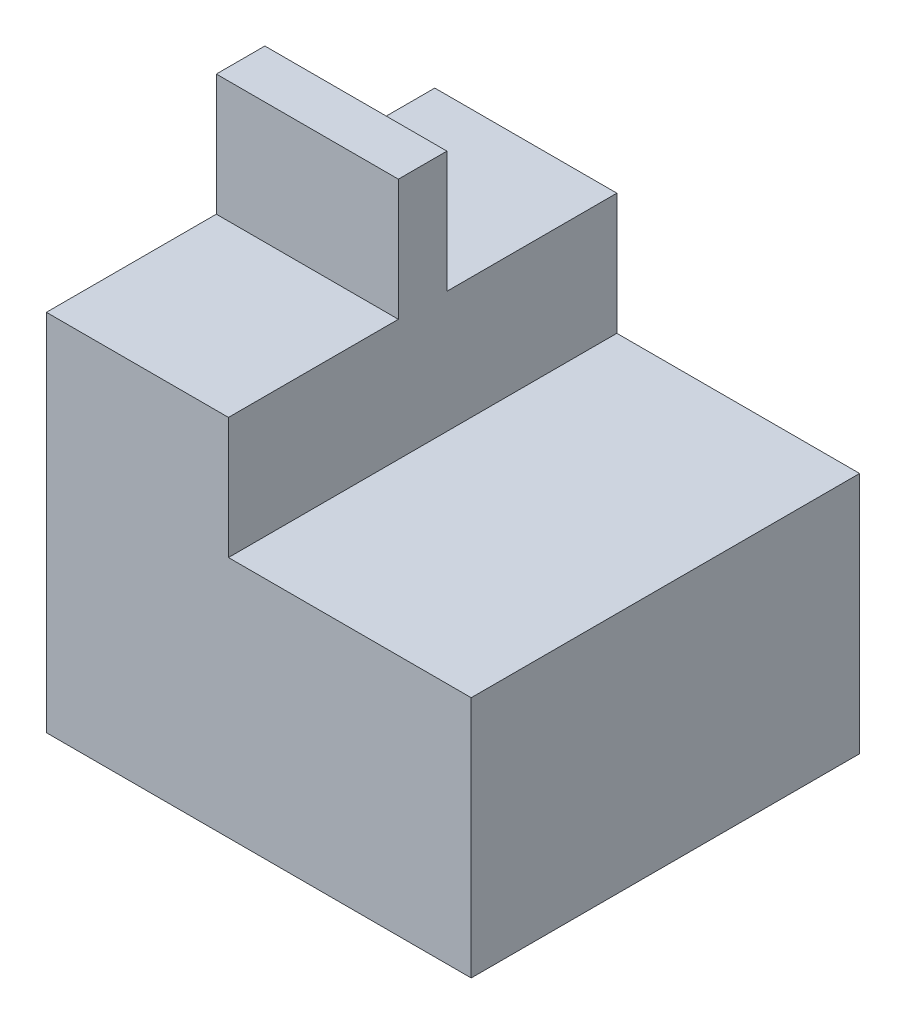
ISO-10303-21;
HEADER;
FILE_DESCRIPTION(('STEP AP214'),'2;1');
FILE_NAME('part.step','',(''),(''),'','','');
FILE_SCHEMA(('AUTOMOTIVE_DESIGN { 1 0 10303 214 1 1 1 1 }'));
ENDSEC;
DATA;
#1=APPLICATION_CONTEXT('core data for automotive mechanical design processes');
#2=APPLICATION_PROTOCOL_DEFINITION('international standard','automotive_design',2000,#1);
#3=PRODUCT_CONTEXT('',#1,'mechanical');
#4=PRODUCT('Part','Part','',(#3));
#5=PRODUCT_RELATED_PRODUCT_CATEGORY('part','',(#4));
#6=PRODUCT_DEFINITION_FORMATION('','',#4);
#7=PRODUCT_DEFINITION_CONTEXT('part definition',#1,'design');
#8=PRODUCT_DEFINITION('design','',#6,#7);
#9=PRODUCT_DEFINITION_SHAPE('','',#8);
#10=(LENGTH_UNIT() NAMED_UNIT(*) SI_UNIT(.MILLI.,.METRE.));
#11=(NAMED_UNIT(*) PLANE_ANGLE_UNIT() SI_UNIT($,.RADIAN.));
#12=(NAMED_UNIT(*) SI_UNIT($,.STERADIAN.) SOLID_ANGLE_UNIT());
#13=UNCERTAINTY_MEASURE_WITH_UNIT(LENGTH_MEASURE(1.E-05),#10,'distance_accuracy_value','');
#14=(GEOMETRIC_REPRESENTATION_CONTEXT(3) GLOBAL_UNCERTAINTY_ASSIGNED_CONTEXT((#13)) GLOBAL_UNIT_ASSIGNED_CONTEXT((#10,
#11,#12)) REPRESENTATION_CONTEXT('',''));
#15=CARTESIAN_POINT('',(0.,0.,0.));
#16=DIRECTION('',(0.,0.,1.));
#17=DIRECTION('',(1.,0.,0.));
#18=AXIS2_PLACEMENT_3D('',#15,#16,#17);
#19=CARTESIAN_POINT('',(-36.0322495659062,12.8778868253245,32.));
#20=DIRECTION('',(-1.,0.,0.));
#21=DIRECTION('',(0.,-1.,0.));
#22=AXIS2_PLACEMENT_3D('',#19,#20,#21);
#23=PLANE('',#22);
#24=DIRECTION('',(0.,0.,-1.));
#25=VECTOR('',#24,1.);
#26=CARTESIAN_POINT('',(-36.0322495659062,32.8778868253245,32.));
#27=LINE('',#26,#25);
#28=CARTESIAN_POINT('',(-36.0322495659062,32.8778868253245,18.));
#29=VERTEX_POINT('',#28);
#30=CARTESIAN_POINT('',(-36.0322495659062,32.8778868253245,14.));
#31=VERTEX_POINT('',#30);
#32=EDGE_CURVE('E236',#29,#31,#27,.T.);
#33=ORIENTED_EDGE('',*,*,#32,.F.);
#34=DIRECTION('',(0.,1.,0.));
#35=VECTOR('',#34,1.);
#36=CARTESIAN_POINT('',(-36.0322495659062,32.8778868253245,18.));
#37=LINE('',#36,#35);
#38=CARTESIAN_POINT('',(-36.0322495659062,22.8778868253245,18.));
#39=VERTEX_POINT('',#38);
#40=EDGE_CURVE('E154',#39,#29,#37,.T.);
#41=ORIENTED_EDGE('',*,*,#40,.F.);
#42=DIRECTION('',(0.,0.,-1.));
#43=VECTOR('',#42,1.);
#44=CARTESIAN_POINT('',(-36.0322495659062,22.8778868253245,32.));
#45=LINE('',#44,#43);
#46=CARTESIAN_POINT('',(-36.0322495659062,22.8778868253245,32.));
#47=VERTEX_POINT('',#46);
#48=EDGE_CURVE('E135',#47,#39,#45,.T.);
#49=ORIENTED_EDGE('',*,*,#48,.F.);
#50=DIRECTION('',(0.,1.,0.));
#51=VECTOR('',#50,1.);
#52=CARTESIAN_POINT('',(-36.0322495659062,12.8778868253245,32.));
#53=LINE('',#52,#51);
#54=CARTESIAN_POINT('',(-36.0322495659062,12.8778868253245,32.));
#55=VERTEX_POINT('',#54);
#56=EDGE_CURVE('E200',#55,#47,#53,.T.);
#57=ORIENTED_EDGE('',*,*,#56,.F.);
#58=DIRECTION('',(0.,0.,-1.));
#59=VECTOR('',#58,1.);
#60=CARTESIAN_POINT('',(-36.0322495659062,12.8778868253245,32.));
#61=LINE('',#60,#59);
#62=CARTESIAN_POINT('',(-36.0322495659062,12.8778868253245,0.));
#63=VERTEX_POINT('',#62);
#64=EDGE_CURVE('E211',#55,#63,#61,.T.);
#65=ORIENTED_EDGE('',*,*,#64,.T.);
#66=DIRECTION('',(0.,1.,0.));
#67=VECTOR('',#66,1.);
#68=CARTESIAN_POINT('',(-36.0322495659062,12.8778868253245,0.));
#69=LINE('',#68,#67);
#70=CARTESIAN_POINT('',(-36.0322495659062,22.8778868253245,0.));
#71=VERTEX_POINT('',#70);
#72=EDGE_CURVE('E196',#63,#71,#69,.T.);
#73=ORIENTED_EDGE('',*,*,#72,.T.);
#74=DIRECTION('',(0.,0.,-1.));
#75=VECTOR('',#74,1.);
#76=CARTESIAN_POINT('',(-36.0322495659062,22.8778868253245,0.));
#77=LINE('',#76,#75);
#78=CARTESIAN_POINT('',(-36.0322495659062,22.8778868253245,14.));
#79=VERTEX_POINT('',#78);
#80=EDGE_CURVE('E186',#79,#71,#77,.T.);
#81=ORIENTED_EDGE('',*,*,#80,.F.);
#82=DIRECTION('',(0.,-1.,0.));
#83=VECTOR('',#82,1.);
#84=CARTESIAN_POINT('',(-36.0322495659062,32.8778868253245,14.));
#85=LINE('',#84,#83);
#86=EDGE_CURVE('E160',#31,#79,#85,.T.);
#87=ORIENTED_EDGE('',*,*,#86,.F.);
#88=EDGE_LOOP('',(#33,#41,#49,#57,#65,#73,#81,#87));
#89=FACE_BOUND('',#88,.T.);
#90=ADVANCED_FACE('F33',(#89),#23,.F.);
#91=CARTESIAN_POINT('',(-36.0322495659062,32.8778868253245,32.));
#92=DIRECTION('',(0.,-1.,0.));
#93=DIRECTION('',(0.,0.,-1.));
#94=AXIS2_PLACEMENT_3D('',#91,#92,#93);
#95=PLANE('',#94);
#96=DIRECTION('',(0.,0.,-1.));
#97=VECTOR('',#96,1.);
#98=CARTESIAN_POINT('',(-51.0322495659062,32.8778868253245,32.));
#99=LINE('',#98,#97);
#100=CARTESIAN_POINT('',(-51.0322495659062,32.8778868253245,18.));
#101=VERTEX_POINT('',#100);
#102=CARTESIAN_POINT('',(-51.0322495659062,32.8778868253245,14.));
#103=VERTEX_POINT('',#102);
#104=EDGE_CURVE('E234',#101,#103,#99,.T.);
#105=ORIENTED_EDGE('',*,*,#104,.F.);
#106=DIRECTION('',(1.,0.,0.));
#107=VECTOR('',#106,1.);
#108=CARTESIAN_POINT('',(-51.0322495659062,32.8778868253245,18.));
#109=LINE('',#108,#107);
#110=EDGE_CURVE('E138',#101,#29,#109,.T.);
#111=ORIENTED_EDGE('',*,*,#110,.T.);
#112=ORIENTED_EDGE('',*,*,#32,.T.);
#113=DIRECTION('',(1.,0.,0.));
#114=VECTOR('',#113,1.);
#115=CARTESIAN_POINT('',(-51.0322495659062,32.8778868253245,14.));
#116=LINE('',#115,#114);
#117=EDGE_CURVE('E189',#103,#31,#116,.T.);
#118=ORIENTED_EDGE('',*,*,#117,.F.);
#119=EDGE_LOOP('',(#105,#111,#112,#118));
#120=FACE_BOUND('',#119,.T.);
#121=ADVANCED_FACE('F282',(#120),#95,.F.);
#122=CARTESIAN_POINT('',(-51.0322495659062,32.8778868253245,32.));
#123=DIRECTION('',(1.,0.,0.));
#124=DIRECTION('',(0.,0.,-1.));
#125=AXIS2_PLACEMENT_3D('',#122,#123,#124);
#126=PLANE('',#125);
#127=DIRECTION('',(0.,0.,1.));
#128=VECTOR('',#127,1.);
#129=CARTESIAN_POINT('',(-51.0322495659062,-2.12211317467547,10.));
#130=LINE('',#129,#128);
#131=CARTESIAN_POINT('',(-51.0322495659062,-2.12211317467547,10.));
#132=VERTEX_POINT('',#131);
#133=CARTESIAN_POINT('',(-51.0322495659062,-2.12211317467547,22.));
#134=VERTEX_POINT('',#133);
#135=EDGE_CURVE('E170',#132,#134,#130,.T.);
#136=ORIENTED_EDGE('',*,*,#135,.T.);
#137=DIRECTION('',(0.,-1.,0.));
#138=VECTOR('',#137,1.);
#139=CARTESIAN_POINT('',(-51.0322495659062,-12.1221131746755,22.));
#140=LINE('',#139,#138);
#141=CARTESIAN_POINT('',(-51.0322495659062,-7.12211317467548,22.));
#142=VERTEX_POINT('',#141);
#143=EDGE_CURVE('E163',#134,#142,#140,.T.);
#144=ORIENTED_EDGE('',*,*,#143,.T.);
#145=DIRECTION('',(0.,0.,-1.));
#146=VECTOR('',#145,1.);
#147=CARTESIAN_POINT('',(-51.0322495659062,-7.12211317467548,32.));
#148=LINE('',#147,#146);
#149=CARTESIAN_POINT('',(-51.0322495659062,-7.12211317467548,32.));
#150=VERTEX_POINT('',#149);
#151=EDGE_CURVE('E231',#150,#142,#148,.T.);
#152=ORIENTED_EDGE('',*,*,#151,.F.);
#153=DIRECTION('',(0.,-1.,0.));
#154=VECTOR('',#153,1.);
#155=CARTESIAN_POINT('',(-51.0322495659062,32.8778868253245,32.));
#156=LINE('',#155,#154);
#157=CARTESIAN_POINT('',(-51.0322495659062,22.8778868253245,32.));
#158=VERTEX_POINT('',#157);
#159=EDGE_CURVE('E153',#158,#150,#156,.T.);
#160=ORIENTED_EDGE('',*,*,#159,.F.);
#161=DIRECTION('',(0.,0.,-1.));
#162=VECTOR('',#161,1.);
#163=CARTESIAN_POINT('',(-51.0322495659062,22.8778868253245,32.));
#164=LINE('',#163,#162);
#165=CARTESIAN_POINT('',(-51.0322495659062,22.8778868253245,18.));
#166=VERTEX_POINT('',#165);
#167=EDGE_CURVE('E55',#158,#166,#164,.T.);
#168=ORIENTED_EDGE('',*,*,#167,.T.);
#169=DIRECTION('',(0.,1.,0.));
#170=VECTOR('',#169,1.);
#171=CARTESIAN_POINT('',(-51.0322495659062,32.8778868253245,18.));
#172=LINE('',#171,#170);
#173=EDGE_CURVE('E142',#166,#101,#172,.T.);
#174=ORIENTED_EDGE('',*,*,#173,.T.);
#175=ORIENTED_EDGE('',*,*,#104,.T.);
#176=DIRECTION('',(0.,-1.,0.));
#177=VECTOR('',#176,1.);
#178=CARTESIAN_POINT('',(-51.0322495659062,32.8778868253245,14.));
#179=LINE('',#178,#177);
#180=CARTESIAN_POINT('',(-51.0322495659062,22.8778868253245,14.));
#181=VERTEX_POINT('',#180);
#182=EDGE_CURVE('E182',#103,#181,#179,.T.);
#183=ORIENTED_EDGE('',*,*,#182,.T.);
#184=DIRECTION('',(0.,0.,-1.));
#185=VECTOR('',#184,1.);
#186=CARTESIAN_POINT('',(-51.0322495659062,22.8778868253245,0.));
#187=LINE('',#186,#185);
#188=CARTESIAN_POINT('',(-51.0322495659062,22.8778868253245,0.));
#189=VERTEX_POINT('',#188);
#190=EDGE_CURVE('E185',#181,#189,#187,.T.);
#191=ORIENTED_EDGE('',*,*,#190,.T.);
#192=DIRECTION('',(0.,-1.,0.));
#193=VECTOR('',#192,1.);
#194=CARTESIAN_POINT('',(-51.0322495659062,32.8778868253245,0.));
#195=LINE('',#194,#193);
#196=CARTESIAN_POINT('',(-51.0322495659062,-7.12211317467548,0.));
#197=VERTEX_POINT('',#196);
#198=EDGE_CURVE('E214',#189,#197,#195,.T.);
#199=ORIENTED_EDGE('',*,*,#198,.T.);
#200=CARTESIAN_POINT('',(-51.0322495659062,-7.12211317467548,10.));
#201=VERTEX_POINT('',#200);
#202=EDGE_CURVE('E230',#201,#197,#148,.T.);
#203=ORIENTED_EDGE('',*,*,#202,.F.);
#204=DIRECTION('',(0.,1.,0.));
#205=VECTOR('',#204,1.);
#206=CARTESIAN_POINT('',(-51.0322495659062,-12.1221131746755,10.));
#207=LINE('',#206,#205);
#208=EDGE_CURVE('E166',#201,#132,#207,.T.);
#209=ORIENTED_EDGE('',*,*,#208,.T.);
#210=EDGE_LOOP('',(#136,#144,#152,#160,#168,#174,#175,#183,#191,#199,#203,#209));
#211=FACE_BOUND('',#210,.T.);
#212=ADVANCED_FACE('F151',(#211),#126,.F.);
#213=CARTESIAN_POINT('',(-51.0322495659062,-7.12211317467548,32.));
#214=DIRECTION('',(0.,1.,0.));
#215=DIRECTION('',(0.,0.,1.));
#216=AXIS2_PLACEMENT_3D('',#213,#214,#215);
#217=PLANE('',#216);
#218=ORIENTED_EDGE('',*,*,#151,.T.);
#219=DIRECTION('',(1.,0.,0.));
#220=VECTOR('',#219,1.);
#221=CARTESIAN_POINT('',(-51.0322495659062,-7.12211317467548,22.));
#222=LINE('',#221,#220);
#223=CARTESIAN_POINT('',(-36.0322495659062,-7.12211317467548,22.));
#224=VERTEX_POINT('',#223);
#225=EDGE_CURVE('E11',#142,#224,#222,.T.);
#226=ORIENTED_EDGE('',*,*,#225,.T.);
#227=DIRECTION('',(0.,0.,-1.));
#228=VECTOR('',#227,1.);
#229=CARTESIAN_POINT('',(-36.0322495659062,-7.12211317467548,32.));
#230=LINE('',#229,#228);
#231=CARTESIAN_POINT('',(-36.0322495659062,-7.12211317467548,10.));
#232=VERTEX_POINT('',#231);
#233=EDGE_CURVE('E239',#224,#232,#230,.T.);
#234=ORIENTED_EDGE('',*,*,#233,.T.);
#235=DIRECTION('',(-1.,0.,0.));
#236=VECTOR('',#235,1.);
#237=CARTESIAN_POINT('',(-51.0322495659062,-7.12211317467548,9.99999999999999));
#238=LINE('',#237,#236);
#239=EDGE_CURVE('E40',#232,#201,#238,.T.);
#240=ORIENTED_EDGE('',*,*,#239,.T.);
#241=ORIENTED_EDGE('',*,*,#202,.T.);
#242=DIRECTION('',(1.,0.,0.));
#243=VECTOR('',#242,1.);
#244=CARTESIAN_POINT('',(-51.0322495659062,-7.12211317467548,0.));
#245=LINE('',#244,#243);
#246=CARTESIAN_POINT('',(-16.0322495659062,-7.12211317467548,0.));
#247=VERTEX_POINT('',#246);
#248=EDGE_CURVE('E217',#197,#247,#245,.T.);
#249=ORIENTED_EDGE('',*,*,#248,.T.);
#250=DIRECTION('',(0.,0.,-1.));
#251=VECTOR('',#250,1.);
#252=CARTESIAN_POINT('',(-16.0322495659062,-7.12211317467548,32.));
#253=LINE('',#252,#251);
#254=CARTESIAN_POINT('',(-16.0322495659062,-7.12211317467548,32.));
#255=VERTEX_POINT('',#254);
#256=EDGE_CURVE('E227',#255,#247,#253,.T.);
#257=ORIENTED_EDGE('',*,*,#256,.F.);
#258=DIRECTION('',(1.,0.,0.));
#259=VECTOR('',#258,1.);
#260=CARTESIAN_POINT('',(-51.0322495659062,-7.12211317467548,32.));
#261=LINE('',#260,#259);
#262=EDGE_CURVE('E205',#150,#255,#261,.T.);
#263=ORIENTED_EDGE('',*,*,#262,.F.);
#264=EDGE_LOOP('',(#218,#226,#234,#240,#241,#249,#257,#263));
#265=FACE_BOUND('',#264,.T.);
#266=ADVANCED_FACE('F244',(#265),#217,.F.);
#267=CARTESIAN_POINT('',(-16.0322495659062,-7.12211317467548,32.));
#268=DIRECTION('',(-1.,0.,0.));
#269=DIRECTION('',(0.,0.,1.));
#270=AXIS2_PLACEMENT_3D('',#267,#268,#269);
#271=PLANE('',#270);
#272=DIRECTION('',(0.,1.,0.));
#273=VECTOR('',#272,1.);
#274=CARTESIAN_POINT('',(-16.0322495659062,-7.12211317467548,0.));
#275=LINE('',#274,#273);
#276=CARTESIAN_POINT('',(-16.0322495659062,12.8778868253245,0.));
#277=VERTEX_POINT('',#276);
#278=EDGE_CURVE('E219',#247,#277,#275,.T.);
#279=ORIENTED_EDGE('',*,*,#278,.T.);
#280=DIRECTION('',(0.,0.,-1.));
#281=VECTOR('',#280,1.);
#282=CARTESIAN_POINT('',(-16.0322495659062,12.8778868253245,32.));
#283=LINE('',#282,#281);
#284=CARTESIAN_POINT('',(-16.0322495659062,12.8778868253245,32.));
#285=VERTEX_POINT('',#284);
#286=EDGE_CURVE('E224',#285,#277,#283,.T.);
#287=ORIENTED_EDGE('',*,*,#286,.F.);
#288=DIRECTION('',(0.,1.,0.));
#289=VECTOR('',#288,1.);
#290=CARTESIAN_POINT('',(-16.0322495659062,-7.12211317467548,32.));
#291=LINE('',#290,#289);
#292=EDGE_CURVE('E207',#255,#285,#291,.T.);
#293=ORIENTED_EDGE('',*,*,#292,.F.);
#294=ORIENTED_EDGE('',*,*,#256,.T.);
#295=EDGE_LOOP('',(#279,#287,#293,#294));
#296=FACE_BOUND('',#295,.T.);
#297=ADVANCED_FACE('F257',(#296),#271,.F.);
#298=CARTESIAN_POINT('',(-16.0322495659062,12.8778868253245,32.));
#299=DIRECTION('',(0.,-1.,0.));
#300=DIRECTION('',(1.,0.,0.));
#301=AXIS2_PLACEMENT_3D('',#298,#299,#300);
#302=PLANE('',#301);
#303=DIRECTION('',(-1.,0.,0.));
#304=VECTOR('',#303,1.);
#305=CARTESIAN_POINT('',(-16.0322495659062,12.8778868253245,0.));
#306=LINE('',#305,#304);
#307=EDGE_CURVE('E203',#277,#63,#306,.T.);
#308=ORIENTED_EDGE('',*,*,#307,.T.);
#309=ORIENTED_EDGE('',*,*,#64,.F.);
#310=DIRECTION('',(-1.,0.,0.));
#311=VECTOR('',#310,1.);
#312=CARTESIAN_POINT('',(-16.0322495659062,12.8778868253245,32.));
#313=LINE('',#312,#311);
#314=EDGE_CURVE('E209',#285,#55,#313,.T.);
#315=ORIENTED_EDGE('',*,*,#314,.F.);
#316=ORIENTED_EDGE('',*,*,#286,.T.);
#317=EDGE_LOOP('',(#308,#309,#315,#316));
#318=FACE_BOUND('',#317,.T.);
#319=ADVANCED_FACE('F299',(#318),#302,.F.);
#320=CARTESIAN_POINT('',(0.,0.,32.));
#321=DIRECTION('',(0.,0.,1.));
#322=DIRECTION('',(1.,0.,0.));
#323=AXIS2_PLACEMENT_3D('',#320,#321,#322);
#324=PLANE('',#323);
#325=DIRECTION('',(1.,0.,0.));
#326=VECTOR('',#325,1.);
#327=CARTESIAN_POINT('',(-51.0322495659062,22.8778868253245,32.));
#328=LINE('',#327,#326);
#329=EDGE_CURVE('E139',#158,#47,#328,.T.);
#330=ORIENTED_EDGE('',*,*,#329,.F.);
#331=ORIENTED_EDGE('',*,*,#159,.T.);
#332=ORIENTED_EDGE('',*,*,#262,.T.);
#333=ORIENTED_EDGE('',*,*,#292,.T.);
#334=ORIENTED_EDGE('',*,*,#314,.T.);
#335=ORIENTED_EDGE('',*,*,#56,.T.);
#336=EDGE_LOOP('',(#330,#331,#332,#333,#334,#335));
#337=FACE_BOUND('',#336,.T.);
#338=ADVANCED_FACE('F261',(#337),#324,.T.);
#339=CARTESIAN_POINT('',(0.,0.,0.));
#340=DIRECTION('',(0.,0.,1.));
#341=DIRECTION('',(1.,0.,0.));
#342=AXIS2_PLACEMENT_3D('',#339,#340,#341);
#343=PLANE('',#342);
#344=ORIENTED_EDGE('',*,*,#198,.F.);
#345=DIRECTION('',(1.,0.,0.));
#346=VECTOR('',#345,1.);
#347=CARTESIAN_POINT('',(-51.0322495659062,22.8778868253245,0.));
#348=LINE('',#347,#346);
#349=EDGE_CURVE('E193',#189,#71,#348,.T.);
#350=ORIENTED_EDGE('',*,*,#349,.T.);
#351=ORIENTED_EDGE('',*,*,#72,.F.);
#352=ORIENTED_EDGE('',*,*,#307,.F.);
#353=ORIENTED_EDGE('',*,*,#278,.F.);
#354=ORIENTED_EDGE('',*,*,#248,.F.);
#355=EDGE_LOOP('',(#344,#350,#351,#352,#353,#354));
#356=FACE_BOUND('',#355,.T.);
#357=ADVANCED_FACE('F251',(#356),#343,.F.);
#358=CARTESIAN_POINT('',(-51.0322495659062,22.8778868253245,0.));
#359=DIRECTION('',(0.,-1.,0.));
#360=DIRECTION('',(1.,0.,0.));
#361=AXIS2_PLACEMENT_3D('',#358,#359,#360);
#362=PLANE('',#361);
#363=ORIENTED_EDGE('',*,*,#80,.T.);
#364=ORIENTED_EDGE('',*,*,#349,.F.);
#365=ORIENTED_EDGE('',*,*,#190,.F.);
#366=DIRECTION('',(1.,0.,0.));
#367=VECTOR('',#366,1.);
#368=CARTESIAN_POINT('',(-51.0322495659062,22.8778868253245,14.));
#369=LINE('',#368,#367);
#370=EDGE_CURVE('E197',#181,#79,#369,.T.);
#371=ORIENTED_EDGE('',*,*,#370,.T.);
#372=EDGE_LOOP('',(#363,#364,#365,#371));
#373=FACE_BOUND('',#372,.T.);
#374=ADVANCED_FACE('F295',(#373),#362,.F.);
#375=CARTESIAN_POINT('',(-51.0322495659062,32.8778868253245,14.));
#376=DIRECTION('',(0.,0.,1.));
#377=DIRECTION('',(0.,-1.,0.));
#378=AXIS2_PLACEMENT_3D('',#375,#376,#377);
#379=PLANE('',#378);
#380=ORIENTED_EDGE('',*,*,#86,.T.);
#381=ORIENTED_EDGE('',*,*,#370,.F.);
#382=ORIENTED_EDGE('',*,*,#182,.F.);
#383=ORIENTED_EDGE('',*,*,#117,.T.);
#384=EDGE_LOOP('',(#380,#381,#382,#383));
#385=FACE_BOUND('',#384,.T.);
#386=ADVANCED_FACE('F293',(#385),#379,.F.);
#387=CARTESIAN_POINT('',(-51.0322495659062,32.8778868253245,18.));
#388=DIRECTION('',(0.,0.,-1.));
#389=DIRECTION('',(-1.,0.,0.));
#390=AXIS2_PLACEMENT_3D('',#387,#388,#389);
#391=PLANE('',#390);
#392=ORIENTED_EDGE('',*,*,#40,.T.);
#393=ORIENTED_EDGE('',*,*,#110,.F.);
#394=ORIENTED_EDGE('',*,*,#173,.F.);
#395=DIRECTION('',(1.,0.,0.));
#396=VECTOR('',#395,1.);
#397=CARTESIAN_POINT('',(-51.0322495659062,22.8778868253245,18.));
#398=LINE('',#397,#396);
#399=EDGE_CURVE('E131',#166,#39,#398,.T.);
#400=ORIENTED_EDGE('',*,*,#399,.T.);
#401=EDGE_LOOP('',(#392,#393,#394,#400));
#402=FACE_BOUND('',#401,.T.);
#403=ADVANCED_FACE('F143',(#402),#391,.F.);
#404=CARTESIAN_POINT('',(-51.0322495659062,22.8778868253245,32.));
#405=DIRECTION('',(0.,-1.,0.));
#406=DIRECTION('',(1.,0.,0.));
#407=AXIS2_PLACEMENT_3D('',#404,#405,#406);
#408=PLANE('',#407);
#409=ORIENTED_EDGE('',*,*,#48,.T.);
#410=ORIENTED_EDGE('',*,*,#399,.F.);
#411=ORIENTED_EDGE('',*,*,#167,.F.);
#412=ORIENTED_EDGE('',*,*,#329,.T.);
#413=EDGE_LOOP('',(#409,#410,#411,#412));
#414=FACE_BOUND('',#413,.T.);
#415=ADVANCED_FACE('F133',(#414),#408,.F.);
#416=CARTESIAN_POINT('',(-51.0322495659062,-12.1221131746755,22.));
#417=DIRECTION('',(0.,0.,1.));
#418=DIRECTION('',(1.,0.,0.));
#419=AXIS2_PLACEMENT_3D('',#416,#417,#418);
#420=PLANE('',#419);
#421=ORIENTED_EDGE('',*,*,#143,.F.);
#422=DIRECTION('',(1.,0.,0.));
#423=VECTOR('',#422,1.);
#424=CARTESIAN_POINT('',(-51.0322495659062,-2.12211317467547,22.));
#425=LINE('',#424,#423);
#426=CARTESIAN_POINT('',(-36.0322495659062,-2.12211317467547,22.));
#427=VERTEX_POINT('',#426);
#428=EDGE_CURVE('E158',#134,#427,#425,.T.);
#429=ORIENTED_EDGE('',*,*,#428,.T.);
#430=DIRECTION('',(0.,-1.,0.));
#431=VECTOR('',#430,1.);
#432=CARTESIAN_POINT('',(-36.0322495659062,-12.1221131746755,22.));
#433=LINE('',#432,#431);
#434=EDGE_CURVE('E173',#427,#224,#433,.T.);
#435=ORIENTED_EDGE('',*,*,#434,.T.);
#436=ORIENTED_EDGE('',*,*,#225,.F.);
#437=EDGE_LOOP('',(#421,#429,#435,#436));
#438=FACE_BOUND('',#437,.T.);
#439=ADVANCED_FACE('F266',(#438),#420,.F.);
#440=CARTESIAN_POINT('',(-51.0322495659062,-12.1221131746755,10.));
#441=DIRECTION('',(0.,0.,-1.));
#442=DIRECTION('',(-1.,0.,0.));
#443=AXIS2_PLACEMENT_3D('',#440,#441,#442);
#444=PLANE('',#443);
#445=DIRECTION('',(0.,1.,0.));
#446=VECTOR('',#445,1.);
#447=CARTESIAN_POINT('',(-36.0322495659062,-12.1221131746755,10.));
#448=LINE('',#447,#446);
#449=CARTESIAN_POINT('',(-36.0322495659062,-2.12211317467547,10.));
#450=VERTEX_POINT('',#449);
#451=EDGE_CURVE('E47',#232,#450,#448,.T.);
#452=ORIENTED_EDGE('',*,*,#451,.T.);
#453=DIRECTION('',(1.,0.,0.));
#454=VECTOR('',#453,1.);
#455=CARTESIAN_POINT('',(-51.0322495659062,-2.12211317467547,10.));
#456=LINE('',#455,#454);
#457=EDGE_CURVE('E172',#132,#450,#456,.T.);
#458=ORIENTED_EDGE('',*,*,#457,.F.);
#459=ORIENTED_EDGE('',*,*,#208,.F.);
#460=ORIENTED_EDGE('',*,*,#239,.F.);
#461=EDGE_LOOP('',(#452,#458,#459,#460));
#462=FACE_BOUND('',#461,.T.);
#463=ADVANCED_FACE('F271',(#462),#444,.F.);
#464=CARTESIAN_POINT('',(-36.0322495659062,0.,0.));
#465=DIRECTION('',(1.,0.,0.));
#466=DIRECTION('',(0.,1.,0.));
#467=AXIS2_PLACEMENT_3D('',#464,#465,#466);
#468=PLANE('',#467);
#469=ORIENTED_EDGE('',*,*,#434,.F.);
#470=DIRECTION('',(0.,0.,1.));
#471=VECTOR('',#470,1.);
#472=CARTESIAN_POINT('',(-36.0322495659062,-2.12211317467547,10.));
#473=LINE('',#472,#471);
#474=EDGE_CURVE('E167',#450,#427,#473,.T.);
#475=ORIENTED_EDGE('',*,*,#474,.F.);
#476=ORIENTED_EDGE('',*,*,#451,.F.);
#477=ORIENTED_EDGE('',*,*,#233,.F.);
#478=EDGE_LOOP('',(#469,#475,#476,#477));
#479=FACE_BOUND('',#478,.T.);
#480=ADVANCED_FACE('F268',(#479),#468,.F.);
#481=CARTESIAN_POINT('',(-51.0322495659062,-2.12211317467547,10.));
#482=DIRECTION('',(0.,1.,0.));
#483=DIRECTION('',(-1.,0.,0.));
#484=AXIS2_PLACEMENT_3D('',#481,#482,#483);
#485=PLANE('',#484);
#486=ORIENTED_EDGE('',*,*,#474,.T.);
#487=ORIENTED_EDGE('',*,*,#428,.F.);
#488=ORIENTED_EDGE('',*,*,#135,.F.);
#489=ORIENTED_EDGE('',*,*,#457,.T.);
#490=EDGE_LOOP('',(#486,#487,#488,#489));
#491=FACE_BOUND('',#490,.T.);
#492=ADVANCED_FACE('F270',(#491),#485,.F.);
#493=CLOSED_SHELL('',(#90,#121,#212,#266,#297,#319,#338,#357,#374,#386,#403,#415,#439,#463,#480,#492));
#494=MANIFOLD_SOLID_BREP('B2',#493);
#495=ADVANCED_BREP_SHAPE_REPRESENTATION('',(#18,#494),#14);
#496=SHAPE_DEFINITION_REPRESENTATION(#9,#495);
ENDSEC;
END-ISO-10303-21;
